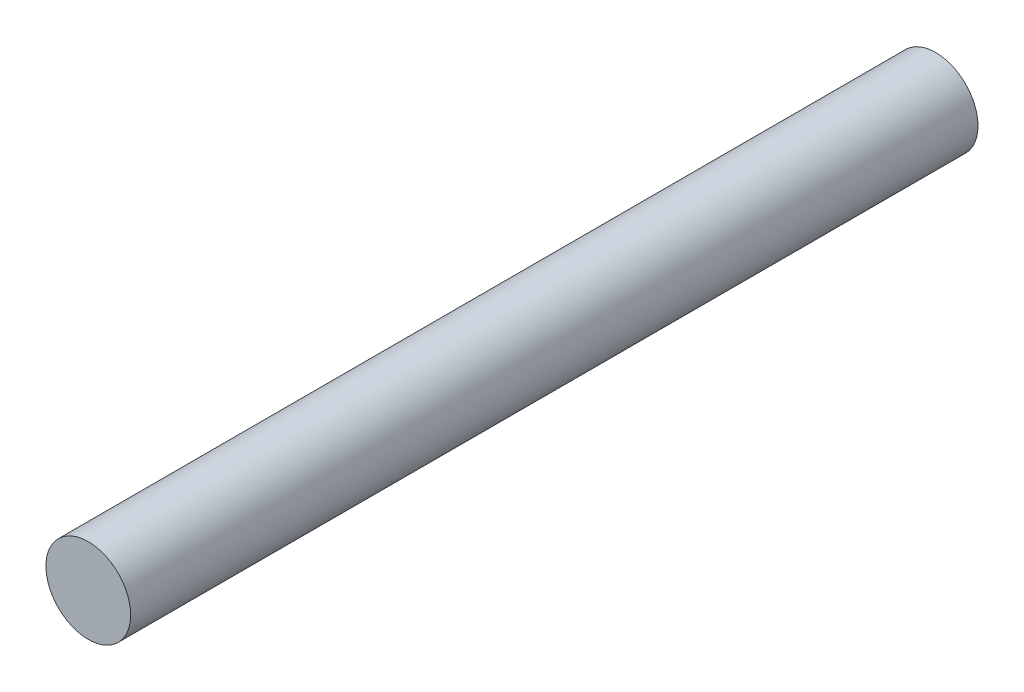
ISO-10303-21;
HEADER;
FILE_DESCRIPTION(('STEP AP214'),'2;1');
FILE_NAME('part.step','',(''),(''),'','','');
FILE_SCHEMA(('AUTOMOTIVE_DESIGN { 1 0 10303 214 1 1 1 1 }'));
ENDSEC;
DATA;
#1=APPLICATION_CONTEXT('core data for automotive mechanical design processes');
#2=APPLICATION_PROTOCOL_DEFINITION('international standard','automotive_design',2000,#1);
#3=PRODUCT_CONTEXT('',#1,'mechanical');
#4=PRODUCT('Part','Part','',(#3));
#5=PRODUCT_RELATED_PRODUCT_CATEGORY('part','',(#4));
#6=PRODUCT_DEFINITION_FORMATION('','',#4);
#7=PRODUCT_DEFINITION_CONTEXT('part definition',#1,'design');
#8=PRODUCT_DEFINITION('design','',#6,#7);
#9=PRODUCT_DEFINITION_SHAPE('','',#8);
#10=(LENGTH_UNIT() NAMED_UNIT(*) SI_UNIT(.MILLI.,.METRE.));
#11=(NAMED_UNIT(*) PLANE_ANGLE_UNIT() SI_UNIT($,.RADIAN.));
#12=(NAMED_UNIT(*) SI_UNIT($,.STERADIAN.) SOLID_ANGLE_UNIT());
#13=UNCERTAINTY_MEASURE_WITH_UNIT(LENGTH_MEASURE(1.E-05),#10,'distance_accuracy_value','');
#14=(GEOMETRIC_REPRESENTATION_CONTEXT(3) GLOBAL_UNCERTAINTY_ASSIGNED_CONTEXT((#13)) GLOBAL_UNIT_ASSIGNED_CONTEXT((#10,
#11,#12)) REPRESENTATION_CONTEXT('',''));
#15=CARTESIAN_POINT('',(0.,0.,0.));
#16=DIRECTION('',(0.,0.,1.));
#17=DIRECTION('',(1.,0.,0.));
#18=AXIS2_PLACEMENT_3D('',#15,#16,#17);
#19=CARTESIAN_POINT('',(0.,0.,0.));
#20=DIRECTION('',(0.,0.,1.));
#21=DIRECTION('',(1.,0.,0.));
#22=AXIS2_PLACEMENT_3D('',#19,#20,#21);
#23=CYLINDRICAL_SURFACE('',#22,63.5);
#24=CARTESIAN_POINT('',(0.,0.,0.));
#25=DIRECTION('',(0.,0.,1.));
#26=DIRECTION('',(1.,0.,0.));
#27=AXIS2_PLACEMENT_3D('',#24,#25,#26);
#28=CIRCLE('',#27,63.5);
#29=CARTESIAN_POINT('',(63.5,0.,0.));
#30=VERTEX_POINT('',#29);
#31=EDGE_CURVE('E10',#30,#30,#28,.T.);
#32=ORIENTED_EDGE('',*,*,#31,.T.);
#33=EDGE_LOOP('',(#32));
#34=FACE_BOUND('',#33,.T.);
#35=CARTESIAN_POINT('',(0.,0.,1270.));
#36=DIRECTION('',(0.,0.,1.));
#37=DIRECTION('',(1.,0.,0.));
#38=AXIS2_PLACEMENT_3D('',#35,#36,#37);
#39=CIRCLE('',#38,63.5);
#40=CARTESIAN_POINT('',(63.5,0.,1270.));
#41=VERTEX_POINT('',#40);
#42=EDGE_CURVE('E38',#41,#41,#39,.T.);
#43=ORIENTED_EDGE('',*,*,#42,.F.);
#44=EDGE_LOOP('',(#43));
#45=FACE_BOUND('',#44,.T.);
#46=ADVANCED_FACE('F32',(#34,#45),#23,.T.);
#47=CARTESIAN_POINT('',(63.5,0.,0.));
#48=DIRECTION('',(0.,0.,-1.));
#49=DIRECTION('',(-1.,0.,0.));
#50=AXIS2_PLACEMENT_3D('',#47,#48,#49);
#51=PLANE('',#50);
#52=ORIENTED_EDGE('',*,*,#31,.F.);
#53=EDGE_LOOP('',(#52));
#54=FACE_BOUND('',#53,.T.);
#55=ADVANCED_FACE('F47',(#54),#51,.T.);
#56=CARTESIAN_POINT('',(0.,0.,1270.));
#57=DIRECTION('',(0.,0.,1.));
#58=DIRECTION('',(1.,0.,0.));
#59=AXIS2_PLACEMENT_3D('',#56,#57,#58);
#60=PLANE('',#59);
#61=ORIENTED_EDGE('',*,*,#42,.T.);
#62=EDGE_LOOP('',(#61));
#63=FACE_BOUND('',#62,.T.);
#64=ADVANCED_FACE('F44',(#63),#60,.T.);
#65=CLOSED_SHELL('',(#46,#55,#64));
#66=MANIFOLD_SOLID_BREP('B2',#65);
#67=ADVANCED_BREP_SHAPE_REPRESENTATION('',(#18,#66),#14);
#68=SHAPE_DEFINITION_REPRESENTATION(#9,#67);
ENDSEC;
END-ISO-10303-21;
